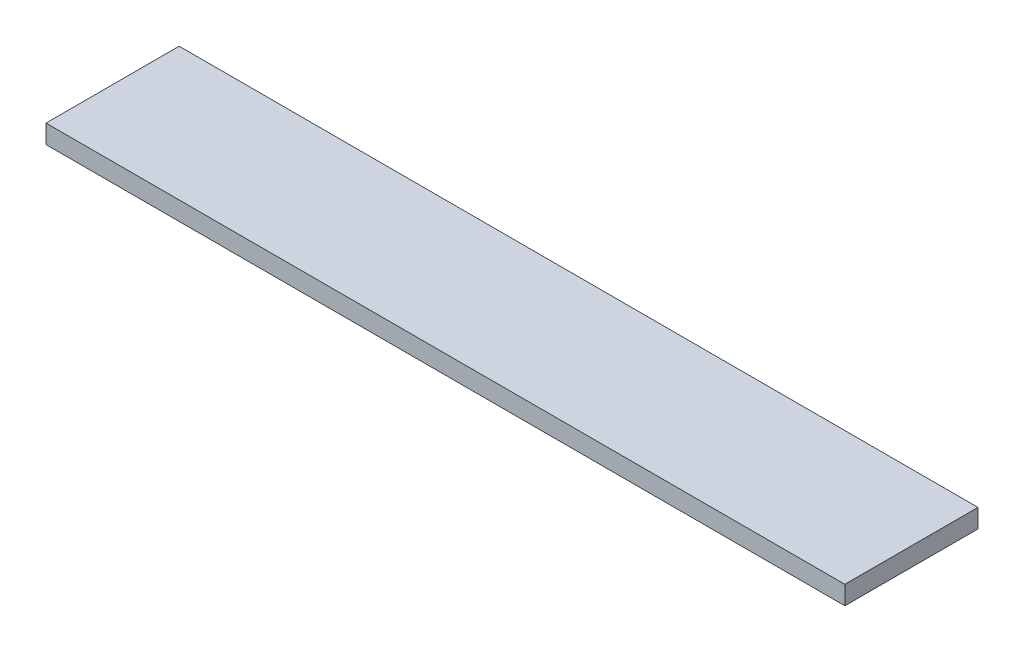
ISO-10303-21;
HEADER;
FILE_DESCRIPTION(('STEP AP214'),'2;1');
FILE_NAME('part.step','',(''),(''),'','','');
FILE_SCHEMA(('AUTOMOTIVE_DESIGN { 1 0 10303 214 1 1 1 1 }'));
ENDSEC;
DATA;
#1=APPLICATION_CONTEXT('core data for automotive mechanical design processes');
#2=APPLICATION_PROTOCOL_DEFINITION('international standard','automotive_design',2000,#1);
#3=PRODUCT_CONTEXT('',#1,'mechanical');
#4=PRODUCT('Part','Part','',(#3));
#5=PRODUCT_RELATED_PRODUCT_CATEGORY('part','',(#4));
#6=PRODUCT_DEFINITION_FORMATION('','',#4);
#7=PRODUCT_DEFINITION_CONTEXT('part definition',#1,'design');
#8=PRODUCT_DEFINITION('design','',#6,#7);
#9=PRODUCT_DEFINITION_SHAPE('','',#8);
#10=(LENGTH_UNIT() NAMED_UNIT(*) SI_UNIT(.MILLI.,.METRE.));
#11=(NAMED_UNIT(*) PLANE_ANGLE_UNIT() SI_UNIT($,.RADIAN.));
#12=(NAMED_UNIT(*) SI_UNIT($,.STERADIAN.) SOLID_ANGLE_UNIT());
#13=UNCERTAINTY_MEASURE_WITH_UNIT(LENGTH_MEASURE(1.E-05),#10,'distance_accuracy_value','');
#14=(GEOMETRIC_REPRESENTATION_CONTEXT(3) GLOBAL_UNCERTAINTY_ASSIGNED_CONTEXT((#13)) GLOBAL_UNIT_ASSIGNED_CONTEXT((#10,
#11,#12)) REPRESENTATION_CONTEXT('',''));
#15=CARTESIAN_POINT('',(0.,0.,0.));
#16=DIRECTION('',(0.,0.,1.));
#17=DIRECTION('',(1.,0.,0.));
#18=AXIS2_PLACEMENT_3D('',#15,#16,#17);
#19=CARTESIAN_POINT('',(15.,0.7,2.5));
#20=DIRECTION('',(-1.,0.,0.));
#21=DIRECTION('',(0.,0.,1.));
#22=AXIS2_PLACEMENT_3D('',#19,#20,#21);
#23=PLANE('',#22);
#24=DIRECTION('',(0.,0.,-1.));
#25=VECTOR('',#24,1.);
#26=CARTESIAN_POINT('',(15.,0.,2.5));
#27=LINE('',#26,#25);
#28=CARTESIAN_POINT('',(15.,0.,2.5));
#29=VERTEX_POINT('',#28);
#30=CARTESIAN_POINT('',(15.,0.,-2.5));
#31=VERTEX_POINT('',#30);
#32=EDGE_CURVE('E96',#29,#31,#27,.T.);
#33=ORIENTED_EDGE('',*,*,#32,.T.);
#34=DIRECTION('',(0.,-1.,0.));
#35=VECTOR('',#34,1.);
#36=CARTESIAN_POINT('',(15.,0.7,-2.5));
#37=LINE('',#36,#35);
#38=CARTESIAN_POINT('',(15.,0.7,-2.5));
#39=VERTEX_POINT('',#38);
#40=EDGE_CURVE('E11',#39,#31,#37,.T.);
#41=ORIENTED_EDGE('',*,*,#40,.F.);
#42=DIRECTION('',(0.,0.,-1.));
#43=VECTOR('',#42,1.);
#44=CARTESIAN_POINT('',(15.,0.7,2.5));
#45=LINE('',#44,#43);
#46=CARTESIAN_POINT('',(15.,0.7,2.5));
#47=VERTEX_POINT('',#46);
#48=EDGE_CURVE('E84',#47,#39,#45,.T.);
#49=ORIENTED_EDGE('',*,*,#48,.F.);
#50=DIRECTION('',(0.,-1.,0.));
#51=VECTOR('',#50,1.);
#52=CARTESIAN_POINT('',(15.,0.7,2.5));
#53=LINE('',#52,#51);
#54=EDGE_CURVE('E92',#47,#29,#53,.T.);
#55=ORIENTED_EDGE('',*,*,#54,.T.);
#56=EDGE_LOOP('',(#33,#41,#49,#55));
#57=FACE_BOUND('',#56,.T.);
#58=ADVANCED_FACE('F33',(#57),#23,.F.);
#59=CARTESIAN_POINT('',(-15.,0.7,-2.5));
#60=DIRECTION('',(0.,0.,1.));
#61=DIRECTION('',(1.,0.,0.));
#62=AXIS2_PLACEMENT_3D('',#59,#60,#61);
#63=PLANE('',#62);
#64=DIRECTION('',(-1.,0.,0.));
#65=VECTOR('',#64,1.);
#66=CARTESIAN_POINT('',(-15.,0.,-2.5));
#67=LINE('',#66,#65);
#68=CARTESIAN_POINT('',(-15.,0.,-2.5));
#69=VERTEX_POINT('',#68);
#70=EDGE_CURVE('E88',#31,#69,#67,.T.);
#71=ORIENTED_EDGE('',*,*,#70,.T.);
#72=DIRECTION('',(0.,-1.,0.));
#73=VECTOR('',#72,1.);
#74=CARTESIAN_POINT('',(-15.,0.7,-2.5));
#75=LINE('',#74,#73);
#76=CARTESIAN_POINT('',(-15.,0.7,-2.5));
#77=VERTEX_POINT('',#76);
#78=EDGE_CURVE('E41',#77,#69,#75,.T.);
#79=ORIENTED_EDGE('',*,*,#78,.F.);
#80=DIRECTION('',(-1.,0.,0.));
#81=VECTOR('',#80,1.);
#82=CARTESIAN_POINT('',(-15.,0.7,-2.5));
#83=LINE('',#82,#81);
#84=EDGE_CURVE('E79',#39,#77,#83,.T.);
#85=ORIENTED_EDGE('',*,*,#84,.F.);
#86=ORIENTED_EDGE('',*,*,#40,.T.);
#87=EDGE_LOOP('',(#71,#79,#85,#86));
#88=FACE_BOUND('',#87,.T.);
#89=ADVANCED_FACE('F87',(#88),#63,.F.);
#90=CARTESIAN_POINT('',(-15.,0.7,2.5));
#91=DIRECTION('',(1.,0.,0.));
#92=DIRECTION('',(0.,0.,-1.));
#93=AXIS2_PLACEMENT_3D('',#90,#91,#92);
#94=PLANE('',#93);
#95=DIRECTION('',(0.,0.,1.));
#96=VECTOR('',#95,1.);
#97=CARTESIAN_POINT('',(-15.,0.,2.5));
#98=LINE('',#97,#96);
#99=CARTESIAN_POINT('',(-15.,0.,2.5));
#100=VERTEX_POINT('',#99);
#101=EDGE_CURVE('E66',#69,#100,#98,.T.);
#102=ORIENTED_EDGE('',*,*,#101,.T.);
#103=DIRECTION('',(0.,-1.,0.));
#104=VECTOR('',#103,1.);
#105=CARTESIAN_POINT('',(-15.,0.7,2.5));
#106=LINE('',#105,#104);
#107=CARTESIAN_POINT('',(-15.,0.7,2.5));
#108=VERTEX_POINT('',#107);
#109=EDGE_CURVE('E89',#108,#100,#106,.T.);
#110=ORIENTED_EDGE('',*,*,#109,.F.);
#111=DIRECTION('',(0.,0.,1.));
#112=VECTOR('',#111,1.);
#113=CARTESIAN_POINT('',(-15.,0.7,2.5));
#114=LINE('',#113,#112);
#115=EDGE_CURVE('E82',#77,#108,#114,.T.);
#116=ORIENTED_EDGE('',*,*,#115,.F.);
#117=ORIENTED_EDGE('',*,*,#78,.T.);
#118=EDGE_LOOP('',(#102,#110,#116,#117));
#119=FACE_BOUND('',#118,.T.);
#120=ADVANCED_FACE('F90',(#119),#94,.F.);
#121=CARTESIAN_POINT('',(-15.,0.7,2.5));
#122=DIRECTION('',(0.,0.,-1.));
#123=DIRECTION('',(-1.,0.,0.));
#124=AXIS2_PLACEMENT_3D('',#121,#122,#123);
#125=PLANE('',#124);
#126=DIRECTION('',(1.,0.,0.));
#127=VECTOR('',#126,1.);
#128=CARTESIAN_POINT('',(-15.,0.,2.5));
#129=LINE('',#128,#127);
#130=EDGE_CURVE('E72',#100,#29,#129,.T.);
#131=ORIENTED_EDGE('',*,*,#130,.T.);
#132=ORIENTED_EDGE('',*,*,#54,.F.);
#133=DIRECTION('',(1.,0.,0.));
#134=VECTOR('',#133,1.);
#135=CARTESIAN_POINT('',(-15.,0.7,2.5));
#136=LINE('',#135,#134);
#137=EDGE_CURVE('E49',#108,#47,#136,.T.);
#138=ORIENTED_EDGE('',*,*,#137,.F.);
#139=ORIENTED_EDGE('',*,*,#109,.T.);
#140=EDGE_LOOP('',(#131,#132,#138,#139));
#141=FACE_BOUND('',#140,.T.);
#142=ADVANCED_FACE('F103',(#141),#125,.F.);
#143=CARTESIAN_POINT('',(0.,0.7,0.));
#144=DIRECTION('',(0.,-1.,0.));
#145=DIRECTION('',(0.,0.,-1.));
#146=AXIS2_PLACEMENT_3D('',#143,#144,#145);
#147=PLANE('',#146);
#148=ORIENTED_EDGE('',*,*,#48,.T.);
#149=ORIENTED_EDGE('',*,*,#84,.T.);
#150=ORIENTED_EDGE('',*,*,#115,.T.);
#151=ORIENTED_EDGE('',*,*,#137,.T.);
#152=EDGE_LOOP('',(#148,#149,#150,#151));
#153=FACE_BOUND('',#152,.T.);
#154=ADVANCED_FACE('F80',(#153),#147,.F.);
#155=CARTESIAN_POINT('',(0.,0.,0.));
#156=DIRECTION('',(0.,-1.,0.));
#157=DIRECTION('',(0.,0.,-1.));
#158=AXIS2_PLACEMENT_3D('',#155,#156,#157);
#159=PLANE('',#158);
#160=ORIENTED_EDGE('',*,*,#32,.F.);
#161=ORIENTED_EDGE('',*,*,#130,.F.);
#162=ORIENTED_EDGE('',*,*,#101,.F.);
#163=ORIENTED_EDGE('',*,*,#70,.F.);
#164=EDGE_LOOP('',(#160,#161,#162,#163));
#165=FACE_BOUND('',#164,.T.);
#166=ADVANCED_FACE('F106',(#165),#159,.T.);
#167=CLOSED_SHELL('',(#58,#89,#120,#142,#154,#166));
#168=MANIFOLD_SOLID_BREP('B2',#167);
#169=ADVANCED_BREP_SHAPE_REPRESENTATION('',(#18,#168),#14);
#170=SHAPE_DEFINITION_REPRESENTATION(#9,#169);
ENDSEC;
END-ISO-10303-21;
